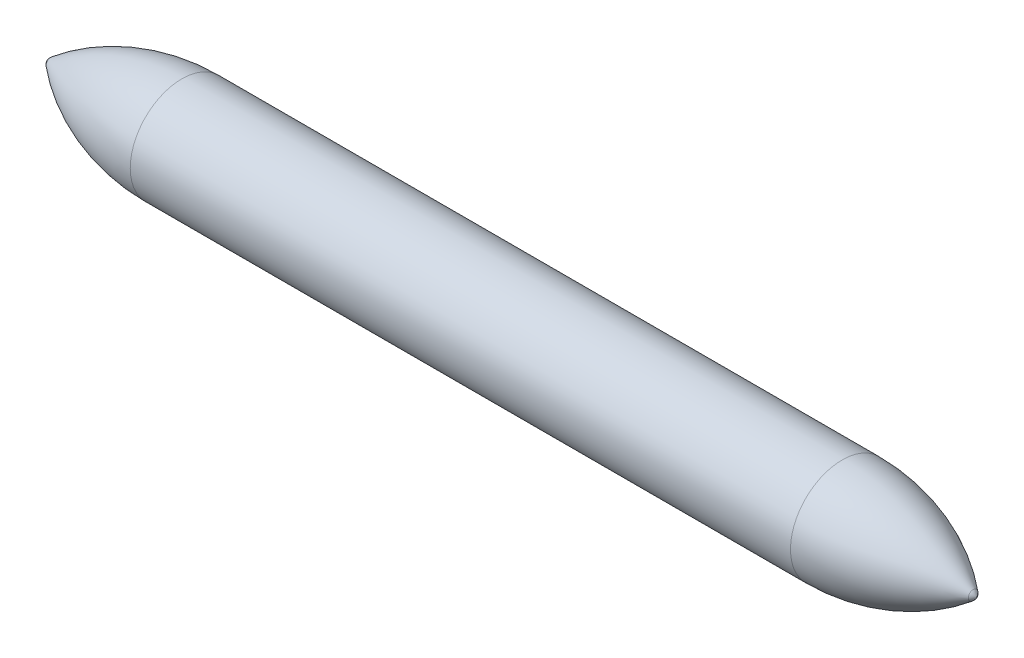
ISO-10303-21;
HEADER;
FILE_DESCRIPTION(('STEP AP214'),'2;1');
FILE_NAME('part.step','',(''),(''),'','','');
FILE_SCHEMA(('AUTOMOTIVE_DESIGN { 1 0 10303 214 1 1 1 1 }'));
ENDSEC;
DATA;
#1=APPLICATION_CONTEXT('core data for automotive mechanical design processes');
#2=APPLICATION_PROTOCOL_DEFINITION('international standard','automotive_design',2000,#1);
#3=PRODUCT_CONTEXT('',#1,'mechanical');
#4=PRODUCT('Part','Part','',(#3));
#5=PRODUCT_RELATED_PRODUCT_CATEGORY('part','',(#4));
#6=PRODUCT_DEFINITION_FORMATION('','',#4);
#7=PRODUCT_DEFINITION_CONTEXT('part definition',#1,'design');
#8=PRODUCT_DEFINITION('design','',#6,#7);
#9=PRODUCT_DEFINITION_SHAPE('','',#8);
#10=(LENGTH_UNIT() NAMED_UNIT(*) SI_UNIT(.MILLI.,.METRE.));
#11=(NAMED_UNIT(*) PLANE_ANGLE_UNIT() SI_UNIT($,.RADIAN.));
#12=(NAMED_UNIT(*) SI_UNIT($,.STERADIAN.) SOLID_ANGLE_UNIT());
#13=UNCERTAINTY_MEASURE_WITH_UNIT(LENGTH_MEASURE(1.E-05),#10,'distance_accuracy_value','');
#14=(GEOMETRIC_REPRESENTATION_CONTEXT(3) GLOBAL_UNCERTAINTY_ASSIGNED_CONTEXT((#13)) GLOBAL_UNIT_ASSIGNED_CONTEXT((#10,
#11,#12)) REPRESENTATION_CONTEXT('',''));
#15=CARTESIAN_POINT('',(0.,0.,0.));
#16=DIRECTION('',(0.,0.,1.));
#17=DIRECTION('',(1.,0.,0.));
#18=AXIS2_PLACEMENT_3D('',#15,#16,#17);
#19=CARTESIAN_POINT('',(15.3923236593438,0.,0.));
#20=DIRECTION('',(-1.00000000000003,0.,0.));
#21=DIRECTION('',(0.,0.,1.));
#22=AXIS2_PLACEMENT_3D('',#19,#20,#21);
#23=DEGENERATE_TOROIDAL_SURFACE('',#22,3.00293439748124,4.00293439748124,.F.);
#24=CARTESIAN_POINT('',(15.3923236593438,0.,0.));
#25=DIRECTION('',(-1.00000000000003,0.,0.));
#26=DIRECTION('',(0.,0.,1.));
#27=AXIS2_PLACEMENT_3D('',#24,#25,#26);
#28=CIRCLE('',#27,1.);
#29=CARTESIAN_POINT('',(15.3923236593438,0.,1.));
#30=VERTEX_POINT('',#29);
#31=EDGE_CURVE('E11',#30,#30,#28,.T.);
#32=ORIENTED_EDGE('',*,*,#31,.F.);
#33=EDGE_LOOP('',(#32));
#34=FACE_BOUND('',#33,.T.);
#35=CARTESIAN_POINT('',(17.9293170674835,0.,0.));
#36=DIRECTION('',(-1.00000000000003,0.,0.));
#37=DIRECTION('',(0.,0.,1.));
#38=AXIS2_PLACEMENT_3D('',#35,#36,#37);
#39=CIRCLE('',#38,0.0933776406689622);
#40=CARTESIAN_POINT('',(17.9293170674835,0.,0.0933776406689553));
#41=VERTEX_POINT('',#40);
#42=EDGE_CURVE('E65',#41,#41,#39,.T.);
#43=ORIENTED_EDGE('',*,*,#42,.T.);
#44=EDGE_LOOP('',(#43));
#45=FACE_BOUND('',#44,.T.);
#46=ADVANCED_FACE('F42',(#34,#45),#23,.F.);
#47=CARTESIAN_POINT('',(-10.9022350993377,0.,0.));
#48=DIRECTION('',(-1.00000000000003,0.,0.));
#49=DIRECTION('',(0.,0.,1.));
#50=AXIS2_PLACEMENT_3D('',#47,#48,#49);
#51=CYLINDRICAL_SURFACE('',#50,1.);
#52=ORIENTED_EDGE('',*,*,#31,.T.);
#53=EDGE_LOOP('',(#52));
#54=FACE_BOUND('',#53,.T.);
#55=CARTESIAN_POINT('',(2.60707316182227,0.,0.));
#56=DIRECTION('',(-1.00000000000003,0.,0.));
#57=DIRECTION('',(0.,0.,1.));
#58=AXIS2_PLACEMENT_3D('',#55,#56,#57);
#59=CIRCLE('',#58,1.);
#60=CARTESIAN_POINT('',(2.60707316182227,0.,0.999999999999996));
#61=VERTEX_POINT('',#60);
#62=EDGE_CURVE('E49',#61,#61,#59,.T.);
#63=ORIENTED_EDGE('',*,*,#62,.F.);
#64=EDGE_LOOP('',(#63));
#65=FACE_BOUND('',#64,.T.);
#66=ADVANCED_FACE('F78',(#54,#65),#51,.T.);
#67=CARTESIAN_POINT('',(2.60707316182227,0.,0.));
#68=DIRECTION('',(-1.00000000000003,0.,0.));
#69=DIRECTION('',(0.,0.,1.));
#70=AXIS2_PLACEMENT_3D('',#67,#68,#69);
#71=DEGENERATE_TOROIDAL_SURFACE('',#70,3.00124674144713,4.00124674144713,.F.);
#72=CARTESIAN_POINT('',(0.070651847547093,0.,0.));
#73=DIRECTION('',(-1.00000000000003,0.,0.));
#74=DIRECTION('',(0.,0.,1.));
#75=AXIS2_PLACEMENT_3D('',#72,#73,#74);
#76=CIRCLE('',#75,0.0933521667204379);
#77=CARTESIAN_POINT('',(0.070651847547093,0.,0.0933521667204397));
#78=VERTEX_POINT('',#77);
#79=EDGE_CURVE('E63',#78,#78,#76,.T.);
#80=ORIENTED_EDGE('',*,*,#79,.F.);
#81=EDGE_LOOP('',(#80));
#82=FACE_BOUND('',#81,.T.);
#83=ORIENTED_EDGE('',*,*,#62,.T.);
#84=EDGE_LOOP('',(#83));
#85=FACE_BOUND('',#84,.T.);
#86=ADVANCED_FACE('F59',(#82,#85),#71,.F.);
#87=CARTESIAN_POINT('',(0.22912878474779,0.,-0.0999999999999966));
#88=DIRECTION('',(0.,-1.00000000000003,0.));
#89=DIRECTION('',(0.,0.,1.));
#90=AXIS2_PLACEMENT_3D('',#87,#88,#89);
#91=CIRCLE('',#90,0.25);
#92=TRIMMED_CURVE('',#91,(PARAMETER_VALUE(-1.15927948072741)),
(PARAMETER_VALUE(1.15927948072741)),.T.,.PARAMETER.);
#93=CARTESIAN_POINT('',(0.22912878474779,0.,0.));
#94=DIRECTION('',(-1.00000000000003,0.,0.));
#95=AXIS1_PLACEMENT('',#93,#94);
#96=SURFACE_OF_REVOLUTION('',#92,#95);
#97=CARTESIAN_POINT('',(0.,0.,0.));
#98=VERTEX_POINT('',#97);
#99=VERTEX_LOOP('',#98);
#100=FACE_BOUND('',#99,.T.);
#101=ORIENTED_EDGE('',*,*,#79,.T.);
#102=EDGE_LOOP('',(#101));
#103=FACE_BOUND('',#102,.T.);
#104=ADVANCED_FACE('F55',(#100,#103),#96,.T.);
#105=CARTESIAN_POINT('',(17.7708712152522,0.,-0.0999999999999983));
#106=DIRECTION('',(0.,-1.00000000000003,0.));
#107=DIRECTION('',(0.,0.,1.));
#108=AXIS2_PLACEMENT_3D('',#105,#106,#107);
#109=CIRCLE('',#108,0.249999999999999);
#110=TRIMMED_CURVE('',#109,(PARAMETER_VALUE(-1.15927948072741)),
(PARAMETER_VALUE(1.15927948072741)),.T.,.PARAMETER.);
#111=CARTESIAN_POINT('',(17.7708712152522,0.,0.));
#112=DIRECTION('',(-1.00000000000003,0.,0.));
#113=AXIS1_PLACEMENT('',#111,#112);
#114=SURFACE_OF_REVOLUTION('',#110,#113);
#115=ORIENTED_EDGE('',*,*,#42,.F.);
#116=EDGE_LOOP('',(#115));
#117=FACE_BOUND('',#116,.T.);
#118=CARTESIAN_POINT('',(18.,0.,0.));
#119=VERTEX_POINT('',#118);
#120=VERTEX_LOOP('',#119);
#121=FACE_BOUND('',#120,.T.);
#122=ADVANCED_FACE('F58',(#117,#121),#114,.T.);
#123=CLOSED_SHELL('',(#46,#66,#86,#104,#122));
#124=MANIFOLD_SOLID_BREP('B2',#123);
#125=ADVANCED_BREP_SHAPE_REPRESENTATION('',(#18,#124),#14);
#126=SHAPE_DEFINITION_REPRESENTATION(#9,#125);
ENDSEC;
END-ISO-10303-21;
